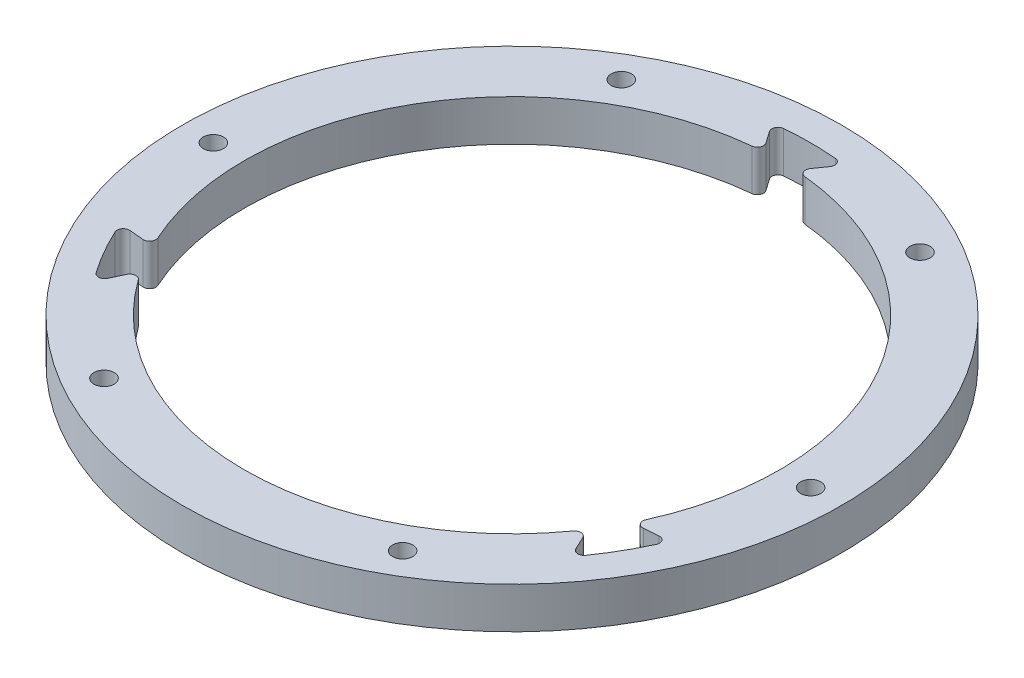
ISO-10303-21;
HEADER;
FILE_DESCRIPTION(('STEP AP214'),'2;1');
FILE_NAME('part.step','',(''),(''),'','','');
FILE_SCHEMA(('AUTOMOTIVE_DESIGN { 1 0 10303 214 1 1 1 1 }'));
ENDSEC;
DATA;
#1=APPLICATION_CONTEXT('core data for automotive mechanical design processes');
#2=APPLICATION_PROTOCOL_DEFINITION('international standard','automotive_design',2000,#1);
#3=PRODUCT_CONTEXT('',#1,'mechanical');
#4=PRODUCT('Part','Part','',(#3));
#5=PRODUCT_RELATED_PRODUCT_CATEGORY('part','',(#4));
#6=PRODUCT_DEFINITION_FORMATION('','',#4);
#7=PRODUCT_DEFINITION_CONTEXT('part definition',#1,'design');
#8=PRODUCT_DEFINITION('design','',#6,#7);
#9=PRODUCT_DEFINITION_SHAPE('','',#8);
#10=(LENGTH_UNIT() NAMED_UNIT(*) SI_UNIT(.MILLI.,.METRE.));
#11=(NAMED_UNIT(*) PLANE_ANGLE_UNIT() SI_UNIT($,.RADIAN.));
#12=(NAMED_UNIT(*) SI_UNIT($,.STERADIAN.) SOLID_ANGLE_UNIT());
#13=UNCERTAINTY_MEASURE_WITH_UNIT(LENGTH_MEASURE(1.E-05),#10,'distance_accuracy_value','');
#14=(GEOMETRIC_REPRESENTATION_CONTEXT(3) GLOBAL_UNCERTAINTY_ASSIGNED_CONTEXT((#13)) GLOBAL_UNIT_ASSIGNED_CONTEXT((#10,
#11,#12)) REPRESENTATION_CONTEXT('',''));
#15=CARTESIAN_POINT('',(0.,0.,0.));
#16=DIRECTION('',(0.,0.,1.));
#17=DIRECTION('',(1.,0.,0.));
#18=AXIS2_PLACEMENT_3D('',#15,#16,#17);
#19=CARTESIAN_POINT('',(0.,10.,80.));
#20=DIRECTION('',(0.,-1.,0.));
#21=DIRECTION('',(0.,0.,-1.));
#22=AXIS2_PLACEMENT_3D('',#19,#20,#21);
#23=PLANE('',#22);
#24=CARTESIAN_POINT('',(-36.2500000000001,10.,-62.7868417743718));
#25=DIRECTION('',(0.,1.,0.));
#26=DIRECTION('',(0.,0.,1.));
#27=AXIS2_PLACEMENT_3D('',#24,#25,#26);
#28=CIRCLE('',#27,2.45744999999999);
#29=CARTESIAN_POINT('',(-36.2500000000001,10.,-60.3293917743718));
#30=VERTEX_POINT('',#29);
#31=EDGE_CURVE('E770',#30,#30,#28,.T.);
#32=ORIENTED_EDGE('',*,*,#31,.F.);
#33=EDGE_LOOP('',(#32));
#34=FACE_BOUND('',#33,.T.);
#35=CARTESIAN_POINT('',(0.,10.,0.));
#36=DIRECTION('',(0.,-1.,0.));
#37=DIRECTION('',(0.,0.,-1.));
#38=AXIS2_PLACEMENT_3D('',#35,#36,#37);
#39=CIRCLE('',#38,80.);
#40=CARTESIAN_POINT('',(0.,10.,-80.));
#41=VERTEX_POINT('',#40);
#42=EDGE_CURVE('E242',#41,#41,#39,.T.);
#43=ORIENTED_EDGE('',*,*,#42,.F.);
#44=EDGE_LOOP('',(#43));
#45=FACE_BOUND('',#44,.T.);
#46=DIRECTION('',(0.422618261740713,0.,0.906307787036644));
#47=VECTOR('',#46,1.);
#48=CARTESIAN_POINT('',(57.9010744784291,10.,43.631589178523));
#49=LINE('',#48,#47);
#50=CARTESIAN_POINT('',(55.3581681828402,10.,38.1783090294255));
#51=VERTEX_POINT('',#50);
#52=CARTESIAN_POINT('',(56.8246262874602,10.,41.3231385834203));
#53=VERTEX_POINT('',#52);
#54=EDGE_CURVE('E360',#51,#53,#49,.T.);
#55=ORIENTED_EDGE('',*,*,#54,.F.);
#56=CARTESIAN_POINT('',(53.9987065022852,10.,38.8122364220365));
#57=DIRECTION('',(0.,-1.,0.));
#58=DIRECTION('',(0.,0.,-1.));
#59=AXIS2_PLACEMENT_3D('',#56,#57,#58);
#60=CIRCLE('',#59,1.5);
#61=CARTESIAN_POINT('',(52.7806905661435,10.,37.9367724425921));
#62=VERTEX_POINT('',#61);
#63=EDGE_CURVE('E325',#51,#62,#60,.F.);
#64=ORIENTED_EDGE('',*,*,#63,.T.);
#65=CARTESIAN_POINT('',(0.,10.,0.));
#66=DIRECTION('',(0.,-1.,0.));
#67=DIRECTION('',(0.,0.,-1.));
#68=AXIS2_PLACEMENT_3D('',#65,#66,#67);
#69=CIRCLE('',#68,65.);
#70=CARTESIAN_POINT('',(-52.7806905661429,10.,37.9367724425928));
#71=VERTEX_POINT('',#70);
#72=EDGE_CURVE('E243',#62,#71,#69,.T.);
#73=ORIENTED_EDGE('',*,*,#72,.T.);
#74=CARTESIAN_POINT('',(-53.9987065022847,10.,38.8122364220373));
#75=DIRECTION('',(0.,-1.,0.));
#76=DIRECTION('',(0.,0.,-1.));
#77=AXIS2_PLACEMENT_3D('',#74,#75,#76);
#78=CIRCLE('',#77,1.5);
#79=CARTESIAN_POINT('',(-55.3581681828397,10.,38.1783090294262));
#80=VERTEX_POINT('',#79);
#81=EDGE_CURVE('E286',#71,#80,#78,.F.);
#82=ORIENTED_EDGE('',*,*,#81,.T.);
#83=DIRECTION('',(0.4226182617407,0.,-0.90630778703665));
#84=VECTOR('',#83,1.);
#85=CARTESIAN_POINT('',(-54.2506339535424,10.,35.8031942099969));
#86=LINE('',#85,#84);
#87=CARTESIAN_POINT('',(-56.8246262874596,10.,41.3231385834211));
#88=VERTEX_POINT('',#87);
#89=EDGE_CURVE('E385',#88,#80,#86,.T.);
#90=ORIENTED_EDGE('',*,*,#89,.F.);
#91=CARTESIAN_POINT('',(-58.1840879680146,10.,40.68921119081));
#92=DIRECTION('',(0.,-1.,0.));
#93=DIRECTION('',(0.,0.,-1.));
#94=AXIS2_PLACEMENT_3D('',#91,#92,#93);
#95=CIRCLE('',#94,1.5);
#96=CARTESIAN_POINT('',(-59.4133292631135,10.,41.5488424131511));
#97=VERTEX_POINT('',#96);
#98=EDGE_CURVE('E314',#88,#97,#95,.T.);
#99=ORIENTED_EDGE('',*,*,#98,.T.);
#100=CARTESIAN_POINT('',(0.,10.,0.));
#101=DIRECTION('',(0.,1.,0.));
#102=DIRECTION('',(-0.866025403784436,0.,0.500000000000004));
#103=AXIS2_PLACEMENT_3D('',#100,#101,#102);
#104=CIRCLE('',#103,72.5);
#105=CARTESIAN_POINT('',(-65.6890176591816,10.,30.6790312586908));
#106=VERTEX_POINT('',#105);
#107=EDGE_CURVE('E372',#106,#97,#104,.T.);
#108=ORIENTED_EDGE('',*,*,#107,.F.);
#109=CARTESIAN_POINT('',(-64.3299345351986,10.,30.0442926809248));
#110=DIRECTION('',(0.,-1.,0.));
#111=DIRECTION('',(0.,0.,-1.));
#112=AXIS2_PLACEMENT_3D('',#109,#110,#111);
#113=CIRCLE('',#112,1.5);
#114=CARTESIAN_POINT('',(-64.1992009210771,10.,28.5500006337871));
#115=VERTEX_POINT('',#114);
#116=EDGE_CURVE('E310',#106,#115,#113,.T.);
#117=ORIENTED_EDGE('',*,*,#116,.T.);
#118=DIRECTION('',(-0.996194698091747,0.,-0.0871557427476483));
#119=VECTOR('',#118,1.);
#120=CARTESIAN_POINT('',(-66.7366018753018,10.,28.3280068154726));
#121=LINE('',#120,#119);
#122=CARTESIAN_POINT('',(-60.7424695844355,10.,28.8524254385981));
#123=VERTEX_POINT('',#122);
#124=EDGE_CURVE('E369',#123,#115,#121,.T.);
#125=ORIENTED_EDGE('',*,*,#124,.F.);
#126=CARTESIAN_POINT('',(-60.611735970314,10.,27.3581333914604));
#127=DIRECTION('',(0.,-1.,0.));
#128=DIRECTION('',(0.,0.,-1.));
#129=AXIS2_PLACEMENT_3D('',#126,#127,#128);
#130=CIRCLE('',#129,1.5);
#131=CARTESIAN_POINT('',(-59.244553955946,10.,26.7410326382696));
#132=VERTEX_POINT('',#131);
#133=EDGE_CURVE('E288',#123,#132,#130,.F.);
#134=ORIENTED_EDGE('',*,*,#133,.T.);
#135=CARTESIAN_POINT('',(-6.46386338980305,10.,-64.6778050808619));
#136=VERTEX_POINT('',#135);
#137=EDGE_CURVE('E244',#132,#136,#69,.T.);
#138=ORIENTED_EDGE('',*,*,#137,.T.);
#139=CARTESIAN_POINT('',(-6.61302946802927,10.,-66.1703698134972));
#140=DIRECTION('',(0.,-1.,0.));
#141=DIRECTION('',(0.,0.,-1.));
#142=AXIS2_PLACEMENT_3D('',#139,#140,#141);
#143=CIRCLE('',#142,1.5);
#144=CARTESIAN_POINT('',(-5.38430140159578,10.,-67.0307344680237));
#145=VERTEX_POINT('',#144);
#146=EDGE_CURVE('E209',#136,#145,#143,.F.);
#147=ORIENTED_EDGE('',*,*,#146,.T.);
#148=DIRECTION('',(0.573576436351042,0.,0.819152044288995));
#149=VECTOR('',#148,1.);
#150=CARTESIAN_POINT('',(-3.88115874571378,10.,-64.8840242801768));
#151=LINE('',#150,#149);
#152=CARTESIAN_POINT('',(-7.37457463361741,10.,-69.8731392172076));
#153=VERTEX_POINT('',#152);
#154=EDGE_CURVE('E229',#153,#145,#151,.T.);
#155=ORIENTED_EDGE('',*,*,#154,.F.);
#156=CARTESIAN_POINT('',(-6.14584656718391,10.,-70.7335038717342));
#157=DIRECTION('',(0.,-1.,0.));
#158=DIRECTION('',(0.,0.,-1.));
#159=AXIS2_PLACEMENT_3D('',#156,#157,#158);
#160=CIRCLE('',#159,1.5);
#161=CARTESIAN_POINT('',(-6.27568839606808,10.,-72.2278736718413));
#162=VERTEX_POINT('',#161);
#163=EDGE_CURVE('E277',#153,#162,#160,.T.);
#164=ORIENTED_EDGE('',*,*,#163,.T.);
#165=CARTESIAN_POINT('',(0.,10.,0.));
#166=DIRECTION('',(0.,1.,0.));
#167=DIRECTION('',(0.,0.,-1.));
#168=AXIS2_PLACEMENT_3D('',#165,#166,#167);
#169=CIRCLE('',#168,72.5);
#170=CARTESIAN_POINT('',(6.27568839606808,10.,-72.2278736718413));
#171=VERTEX_POINT('',#170);
#172=EDGE_CURVE('E225',#171,#162,#169,.T.);
#173=ORIENTED_EDGE('',*,*,#172,.F.);
#174=CARTESIAN_POINT('',(6.14584656718391,10.,-70.7335038717342));
#175=DIRECTION('',(0.,-1.,0.));
#176=DIRECTION('',(0.,0.,-1.));
#177=AXIS2_PLACEMENT_3D('',#174,#175,#176);
#178=CIRCLE('',#177,1.5);
#179=CARTESIAN_POINT('',(7.37457463361741,10.,-69.8731392172076));
#180=VERTEX_POINT('',#179);
#181=EDGE_CURVE('E224',#171,#180,#178,.T.);
#182=ORIENTED_EDGE('',*,*,#181,.T.);
#183=DIRECTION('',(0.573576436351042,0.,-0.819152044288995));
#184=VECTOR('',#183,1.);
#185=CARTESIAN_POINT('',(8.83552739687324,10.,-71.9595959939959));
#186=LINE('',#185,#184);
#187=CARTESIAN_POINT('',(5.38430140159578,10.,-67.0307344680237));
#188=VERTEX_POINT('',#187);
#189=EDGE_CURVE('E215',#188,#180,#186,.T.);
#190=ORIENTED_EDGE('',*,*,#189,.F.);
#191=CARTESIAN_POINT('',(6.61302946802927,10.,-66.1703698134972));
#192=DIRECTION('',(0.,-1.,0.));
#193=DIRECTION('',(0.,0.,-1.));
#194=AXIS2_PLACEMENT_3D('',#191,#192,#193);
#195=CIRCLE('',#194,1.5);
#196=CARTESIAN_POINT('',(6.46386338980305,10.,-64.6778050808619));
#197=VERTEX_POINT('',#196);
#198=EDGE_CURVE('E198',#188,#197,#195,.F.);
#199=ORIENTED_EDGE('',*,*,#198,.T.);
#200=CARTESIAN_POINT('',(59.2445539559464,10.,26.7410326382688));
#201=VERTEX_POINT('',#200);
#202=EDGE_CURVE('E240',#197,#201,#69,.T.);
#203=ORIENTED_EDGE('',*,*,#202,.T.);
#204=CARTESIAN_POINT('',(60.6117359703144,10.,27.3581333914596));
#205=DIRECTION('',(0.,-1.,0.));
#206=DIRECTION('',(0.,0.,-1.));
#207=AXIS2_PLACEMENT_3D('',#204,#205,#206);
#208=CIRCLE('',#207,1.5);
#209=CARTESIAN_POINT('',(60.7424695844359,10.,28.8524254385972));
#210=VERTEX_POINT('',#209);
#211=EDGE_CURVE('E323',#201,#210,#208,.F.);
#212=ORIENTED_EDGE('',*,*,#211,.T.);
#213=DIRECTION('',(-0.996194698091745,0.,0.0871557427476622));
#214=VECTOR('',#213,1.);
#215=CARTESIAN_POINT('',(58.1317926992566,10.,29.0808300701796));
#216=LINE('',#215,#214);
#217=CARTESIAN_POINT('',(64.1992009210775,10.,28.5500006337862));
#218=VERTEX_POINT('',#217);
#219=EDGE_CURVE('E351',#218,#210,#216,.T.);
#220=ORIENTED_EDGE('',*,*,#219,.F.);
#221=CARTESIAN_POINT('',(64.329934535199,10.,30.0442926809239));
#222=DIRECTION('',(0.,-1.,0.));
#223=DIRECTION('',(0.,0.,-1.));
#224=AXIS2_PLACEMENT_3D('',#221,#222,#223);
#225=CIRCLE('',#224,1.5);
#226=CARTESIAN_POINT('',(65.6890176591821,10.,30.6790312586899));
#227=VERTEX_POINT('',#226);
#228=EDGE_CURVE('E43',#218,#227,#225,.T.);
#229=ORIENTED_EDGE('',*,*,#228,.T.);
#230=CARTESIAN_POINT('',(0.,10.,0.));
#231=DIRECTION('',(0.,1.,0.));
#232=DIRECTION('',(0.866025403784443,0.,0.499999999999992));
#233=AXIS2_PLACEMENT_3D('',#230,#231,#232);
#234=CIRCLE('',#233,72.5);
#235=CARTESIAN_POINT('',(59.4133292631141,10.,41.5488424131503));
#236=VERTEX_POINT('',#235);
#237=EDGE_CURVE('E350',#236,#227,#234,.T.);
#238=ORIENTED_EDGE('',*,*,#237,.F.);
#239=CARTESIAN_POINT('',(58.1840879680152,10.,40.6892111908092));
#240=DIRECTION('',(0.,-1.,0.));
#241=DIRECTION('',(0.,0.,-1.));
#242=AXIS2_PLACEMENT_3D('',#239,#240,#241);
#243=CIRCLE('',#242,1.5);
#244=EDGE_CURVE('E344',#236,#53,#243,.T.);
#245=ORIENTED_EDGE('',*,*,#244,.T.);
#246=EDGE_LOOP('',(#55,#64,#73,#82,#90,#99,#108,#117,#125,#134,#138,#147,#155,#164,#173,#182,
#190,#199,#203,#212,#220,#229,#238,#245));
#247=FACE_BOUND('',#246,.T.);
#248=CARTESIAN_POINT('',(-72.5,10.,2.63677968348475E-13));
#249=DIRECTION('',(0.,1.,0.));
#250=DIRECTION('',(0.,0.,1.));
#251=AXIS2_PLACEMENT_3D('',#248,#249,#250);
#252=CIRCLE('',#251,2.45744999999999);
#253=CARTESIAN_POINT('',(-72.5,10.,2.45745000000025));
#254=VERTEX_POINT('',#253);
#255=EDGE_CURVE('E776',#254,#254,#252,.T.);
#256=ORIENTED_EDGE('',*,*,#255,.F.);
#257=EDGE_LOOP('',(#256));
#258=FACE_BOUND('',#257,.T.);
#259=CARTESIAN_POINT('',(-36.2499999999996,10.,62.786841774372));
#260=DIRECTION('',(0.,1.,0.));
#261=DIRECTION('',(0.,0.,1.));
#262=AXIS2_PLACEMENT_3D('',#259,#260,#261);
#263=CIRCLE('',#262,2.45744999999999);
#264=CARTESIAN_POINT('',(-36.2499999999996,10.,65.244291774372));
#265=VERTEX_POINT('',#264);
#266=EDGE_CURVE('E782',#265,#265,#263,.T.);
#267=ORIENTED_EDGE('',*,*,#266,.F.);
#268=EDGE_LOOP('',(#267));
#269=FACE_BOUND('',#268,.T.);
#270=CARTESIAN_POINT('',(36.2500000000001,10.,62.7868417743718));
#271=DIRECTION('',(0.,1.,0.));
#272=DIRECTION('',(0.,0.,1.));
#273=AXIS2_PLACEMENT_3D('',#270,#271,#272);
#274=CIRCLE('',#273,2.45744999999999);
#275=CARTESIAN_POINT('',(36.2500000000001,10.,65.2442917743717));
#276=VERTEX_POINT('',#275);
#277=EDGE_CURVE('E788',#276,#276,#274,.T.);
#278=ORIENTED_EDGE('',*,*,#277,.F.);
#279=EDGE_LOOP('',(#278));
#280=FACE_BOUND('',#279,.T.);
#281=CARTESIAN_POINT('',(72.5,10.,-7.70217223333702E-13));
#282=DIRECTION('',(0.,1.,0.));
#283=DIRECTION('',(0.,0.,1.));
#284=AXIS2_PLACEMENT_3D('',#281,#282,#283);
#285=CIRCLE('',#284,2.45744999999999);
#286=CARTESIAN_POINT('',(72.5,10.,2.45744999999922));
#287=VERTEX_POINT('',#286);
#288=EDGE_CURVE('E794',#287,#287,#285,.T.);
#289=ORIENTED_EDGE('',*,*,#288,.F.);
#290=EDGE_LOOP('',(#289));
#291=FACE_BOUND('',#290,.T.);
#292=CARTESIAN_POINT('',(36.2499999999992,10.,-62.7868417743723));
#293=DIRECTION('',(0.,1.,0.));
#294=DIRECTION('',(0.,0.,1.));
#295=AXIS2_PLACEMENT_3D('',#292,#293,#294);
#296=CIRCLE('',#295,2.45744999999999);
#297=CARTESIAN_POINT('',(36.2499999999992,10.,-60.3293917743723));
#298=VERTEX_POINT('',#297);
#299=EDGE_CURVE('E800',#298,#298,#296,.T.);
#300=ORIENTED_EDGE('',*,*,#299,.F.);
#301=EDGE_LOOP('',(#300));
#302=FACE_BOUND('',#301,.T.);
#303=ADVANCED_FACE('F35',(#34,#45,#247,#258,#269,#280,#291,#302),#23,.F.);
#304=CARTESIAN_POINT('',(0.,-0.750000000000001,0.));
#305=DIRECTION('',(0.,-1.,0.));
#306=DIRECTION('',(0.,0.,-1.));
#307=AXIS2_PLACEMENT_3D('',#304,#305,#306);
#308=CYLINDRICAL_SURFACE('',#307,65.);
#309=CARTESIAN_POINT('',(0.,0.,0.));
#310=DIRECTION('',(0.,-1.,0.));
#311=DIRECTION('',(0.,0.,-1.));
#312=AXIS2_PLACEMENT_3D('',#309,#310,#311);
#313=CIRCLE('',#312,65.);
#314=CARTESIAN_POINT('',(6.46386338980305,0.,-64.6778050808619));
#315=VERTEX_POINT('',#314);
#316=CARTESIAN_POINT('',(59.2445539559464,0.,26.7410326382688));
#317=VERTEX_POINT('',#316);
#318=EDGE_CURVE('E251',#315,#317,#313,.T.);
#319=ORIENTED_EDGE('',*,*,#318,.T.);
#320=DIRECTION('',(0.,-1.,0.));
#321=VECTOR('',#320,1.);
#322=CARTESIAN_POINT('',(59.2445539559464,-0.750000000000001,26.7410326382688));
#323=LINE('',#322,#321);
#324=EDGE_CURVE('E332',#317,#201,#323,.F.);
#325=ORIENTED_EDGE('',*,*,#324,.T.);
#326=ORIENTED_EDGE('',*,*,#202,.F.);
#327=DIRECTION('',(0.,-1.,0.));
#328=VECTOR('',#327,1.);
#329=CARTESIAN_POINT('',(6.46386338980305,-0.750000000000001,-64.6778050808619));
#330=LINE('',#329,#328);
#331=EDGE_CURVE('E203',#197,#315,#330,.T.);
#332=ORIENTED_EDGE('',*,*,#331,.T.);
#333=EDGE_LOOP('',(#319,#325,#326,#332));
#334=FACE_BOUND('',#333,.T.);
#335=ADVANCED_FACE('F461',(#334),#308,.F.);
#336=ORIENTED_EDGE('',*,*,#72,.F.);
#337=DIRECTION('',(0.,-1.,0.));
#338=VECTOR('',#337,1.);
#339=CARTESIAN_POINT('',(52.7806905661435,-0.750000000000001,37.9367724425921));
#340=LINE('',#339,#338);
#341=CARTESIAN_POINT('',(52.7806905661435,0.,37.9367724425921));
#342=VERTEX_POINT('',#341);
#343=EDGE_CURVE('E327',#62,#342,#340,.T.);
#344=ORIENTED_EDGE('',*,*,#343,.T.);
#345=CARTESIAN_POINT('',(-52.7806905661429,0.,37.9367724425928));
#346=VERTEX_POINT('',#345);
#347=EDGE_CURVE('E253',#342,#346,#313,.T.);
#348=ORIENTED_EDGE('',*,*,#347,.T.);
#349=DIRECTION('',(0.,-1.,0.));
#350=VECTOR('',#349,1.);
#351=CARTESIAN_POINT('',(-52.7806905661429,-0.750000000000001,37.9367724425928));
#352=LINE('',#351,#350);
#353=EDGE_CURVE('E297',#346,#71,#352,.F.);
#354=ORIENTED_EDGE('',*,*,#353,.T.);
#355=EDGE_LOOP('',(#336,#344,#348,#354));
#356=FACE_BOUND('',#355,.T.);
#357=ADVANCED_FACE('F411',(#356),#308,.F.);
#358=ORIENTED_EDGE('',*,*,#137,.F.);
#359=DIRECTION('',(0.,-1.,0.));
#360=VECTOR('',#359,1.);
#361=CARTESIAN_POINT('',(-59.244553955946,-0.750000000000001,26.7410326382696));
#362=LINE('',#361,#360);
#363=CARTESIAN_POINT('',(-59.244553955946,0.,26.7410326382696));
#364=VERTEX_POINT('',#363);
#365=EDGE_CURVE('E290',#132,#364,#362,.T.);
#366=ORIENTED_EDGE('',*,*,#365,.T.);
#367=CARTESIAN_POINT('',(-6.46386338980305,0.,-64.6778050808619));
#368=VERTEX_POINT('',#367);
#369=EDGE_CURVE('E250',#364,#368,#313,.T.);
#370=ORIENTED_EDGE('',*,*,#369,.T.);
#371=DIRECTION('',(0.,-1.,0.));
#372=VECTOR('',#371,1.);
#373=CARTESIAN_POINT('',(-6.46386338980305,-0.750000000000001,-64.6778050808619));
#374=LINE('',#373,#372);
#375=EDGE_CURVE('E208',#368,#136,#374,.F.);
#376=ORIENTED_EDGE('',*,*,#375,.T.);
#377=EDGE_LOOP('',(#358,#366,#370,#376));
#378=FACE_BOUND('',#377,.T.);
#379=ADVANCED_FACE('F440',(#378),#308,.F.);
#380=CARTESIAN_POINT('',(0.,0.,65.));
#381=DIRECTION('',(0.,1.,0.));
#382=DIRECTION('',(0.,0.,1.));
#383=AXIS2_PLACEMENT_3D('',#380,#381,#382);
#384=PLANE('',#383);
#385=CARTESIAN_POINT('',(36.2499999999992,0.,-62.7868417743723));
#386=DIRECTION('',(0.,1.,0.));
#387=DIRECTION('',(0.,0.,1.));
#388=AXIS2_PLACEMENT_3D('',#385,#386,#387);
#389=CIRCLE('',#388,2.45745);
#390=CARTESIAN_POINT('',(36.2499999999992,0.,-60.3293917743723));
#391=VERTEX_POINT('',#390);
#392=EDGE_CURVE('E797',#391,#391,#389,.T.);
#393=ORIENTED_EDGE('',*,*,#392,.T.);
#394=EDGE_LOOP('',(#393));
#395=FACE_BOUND('',#394,.T.);
#396=CARTESIAN_POINT('',(72.5,0.,-7.70217223333702E-13));
#397=DIRECTION('',(0.,1.,0.));
#398=DIRECTION('',(0.,0.,1.));
#399=AXIS2_PLACEMENT_3D('',#396,#397,#398);
#400=CIRCLE('',#399,2.45745);
#401=CARTESIAN_POINT('',(72.5,0.,2.45744999999923));
#402=VERTEX_POINT('',#401);
#403=EDGE_CURVE('E791',#402,#402,#400,.T.);
#404=ORIENTED_EDGE('',*,*,#403,.T.);
#405=EDGE_LOOP('',(#404));
#406=FACE_BOUND('',#405,.T.);
#407=CARTESIAN_POINT('',(36.2500000000001,0.,62.7868417743718));
#408=DIRECTION('',(0.,1.,0.));
#409=DIRECTION('',(0.,0.,1.));
#410=AXIS2_PLACEMENT_3D('',#407,#408,#409);
#411=CIRCLE('',#410,2.45745);
#412=CARTESIAN_POINT('',(36.2500000000001,0.,65.2442917743718));
#413=VERTEX_POINT('',#412);
#414=EDGE_CURVE('E785',#413,#413,#411,.T.);
#415=ORIENTED_EDGE('',*,*,#414,.T.);
#416=EDGE_LOOP('',(#415));
#417=FACE_BOUND('',#416,.T.);
#418=CARTESIAN_POINT('',(-36.2499999999996,0.,62.786841774372));
#419=DIRECTION('',(0.,1.,0.));
#420=DIRECTION('',(0.,0.,1.));
#421=AXIS2_PLACEMENT_3D('',#418,#419,#420);
#422=CIRCLE('',#421,2.45745);
#423=CARTESIAN_POINT('',(-36.2499999999996,0.,65.244291774372));
#424=VERTEX_POINT('',#423);
#425=EDGE_CURVE('E779',#424,#424,#422,.T.);
#426=ORIENTED_EDGE('',*,*,#425,.T.);
#427=EDGE_LOOP('',(#426));
#428=FACE_BOUND('',#427,.T.);
#429=CARTESIAN_POINT('',(-72.5,0.,2.63677968348475E-13));
#430=DIRECTION('',(0.,1.,0.));
#431=DIRECTION('',(0.,0.,1.));
#432=AXIS2_PLACEMENT_3D('',#429,#430,#431);
#433=CIRCLE('',#432,2.45745);
#434=CARTESIAN_POINT('',(-72.5,0.,2.45745000000026));
#435=VERTEX_POINT('',#434);
#436=EDGE_CURVE('E773',#435,#435,#433,.T.);
#437=ORIENTED_EDGE('',*,*,#436,.T.);
#438=EDGE_LOOP('',(#437));
#439=FACE_BOUND('',#438,.T.);
#440=CARTESIAN_POINT('',(-36.2500000000001,0.,-62.7868417743718));
#441=DIRECTION('',(0.,1.,0.));
#442=DIRECTION('',(0.,0.,1.));
#443=AXIS2_PLACEMENT_3D('',#440,#441,#442);
#444=CIRCLE('',#443,2.45745);
#445=CARTESIAN_POINT('',(-36.2500000000001,0.,-60.3293917743718));
#446=VERTEX_POINT('',#445);
#447=EDGE_CURVE('E379',#446,#446,#444,.T.);
#448=ORIENTED_EDGE('',*,*,#447,.T.);
#449=EDGE_LOOP('',(#448));
#450=FACE_BOUND('',#449,.T.);
#451=ORIENTED_EDGE('',*,*,#347,.F.);
#452=CARTESIAN_POINT('',(53.9987065022852,0.,38.8122364220365));
#453=DIRECTION('',(0.,1.,0.));
#454=DIRECTION('',(0.,0.,1.));
#455=AXIS2_PLACEMENT_3D('',#452,#453,#454);
#456=CIRCLE('',#455,1.5);
#457=CARTESIAN_POINT('',(55.3581681828402,0.,38.1783090294255));
#458=VERTEX_POINT('',#457);
#459=EDGE_CURVE('E330',#342,#458,#456,.F.);
#460=ORIENTED_EDGE('',*,*,#459,.T.);
#461=DIRECTION('',(0.422618261740713,0.,0.906307787036644));
#462=VECTOR('',#461,1.);
#463=CARTESIAN_POINT('',(57.9010744784291,0.,43.631589178523));
#464=LINE('',#463,#462);
#465=CARTESIAN_POINT('',(56.8246262874602,0.,41.3231385834203));
#466=VERTEX_POINT('',#465);
#467=EDGE_CURVE('E374',#458,#466,#464,.T.);
#468=ORIENTED_EDGE('',*,*,#467,.T.);
#469=CARTESIAN_POINT('',(58.1840879680152,0.,40.6892111908092));
#470=DIRECTION('',(0.,1.,0.));
#471=DIRECTION('',(0.,0.,1.));
#472=AXIS2_PLACEMENT_3D('',#469,#470,#471);
#473=CIRCLE('',#472,1.5);
#474=CARTESIAN_POINT('',(59.4133292631141,0.,41.5488424131503));
#475=VERTEX_POINT('',#474);
#476=EDGE_CURVE('E346',#466,#475,#473,.T.);
#477=ORIENTED_EDGE('',*,*,#476,.T.);
#478=CARTESIAN_POINT('',(0.,0.,0.));
#479=DIRECTION('',(0.,1.,0.));
#480=DIRECTION('',(0.866025403784443,0.,0.499999999999992));
#481=AXIS2_PLACEMENT_3D('',#478,#479,#480);
#482=CIRCLE('',#481,72.5);
#483=CARTESIAN_POINT('',(65.6890176591821,0.,30.6790312586899));
#484=VERTEX_POINT('',#483);
#485=EDGE_CURVE('E367',#475,#484,#482,.T.);
#486=ORIENTED_EDGE('',*,*,#485,.T.);
#487=CARTESIAN_POINT('',(64.329934535199,0.,30.0442926809239));
#488=DIRECTION('',(0.,1.,0.));
#489=DIRECTION('',(0.,0.,1.));
#490=AXIS2_PLACEMENT_3D('',#487,#488,#489);
#491=CIRCLE('',#490,1.5);
#492=CARTESIAN_POINT('',(64.1992009210775,0.,28.5500006337862));
#493=VERTEX_POINT('',#492);
#494=EDGE_CURVE('E11',#484,#493,#491,.T.);
#495=ORIENTED_EDGE('',*,*,#494,.T.);
#496=DIRECTION('',(-0.996194698091745,0.,0.0871557427476622));
#497=VECTOR('',#496,1.);
#498=CARTESIAN_POINT('',(58.1317926992566,0.,29.0808300701796));
#499=LINE('',#498,#497);
#500=CARTESIAN_POINT('',(60.7424695844359,0.,28.8524254385972));
#501=VERTEX_POINT('',#500);
#502=EDGE_CURVE('E366',#493,#501,#499,.T.);
#503=ORIENTED_EDGE('',*,*,#502,.T.);
#504=CARTESIAN_POINT('',(60.6117359703144,0.,27.3581333914596));
#505=DIRECTION('',(0.,1.,0.));
#506=DIRECTION('',(0.,0.,1.));
#507=AXIS2_PLACEMENT_3D('',#504,#505,#506);
#508=CIRCLE('',#507,1.5);
#509=EDGE_CURVE('E50',#501,#317,#508,.F.);
#510=ORIENTED_EDGE('',*,*,#509,.T.);
#511=ORIENTED_EDGE('',*,*,#318,.F.);
#512=CARTESIAN_POINT('',(6.61302946802927,0.,-66.1703698134972));
#513=DIRECTION('',(0.,1.,0.));
#514=DIRECTION('',(0.,0.,1.));
#515=AXIS2_PLACEMENT_3D('',#512,#513,#514);
#516=CIRCLE('',#515,1.5);
#517=CARTESIAN_POINT('',(5.38430140159578,0.,-67.0307344680237));
#518=VERTEX_POINT('',#517);
#519=EDGE_CURVE('E262',#315,#518,#516,.F.);
#520=ORIENTED_EDGE('',*,*,#519,.T.);
#521=DIRECTION('',(0.573576436351042,0.,-0.819152044288995));
#522=VECTOR('',#521,1.);
#523=CARTESIAN_POINT('',(8.83552739687324,0.,-71.9595959939959));
#524=LINE('',#523,#522);
#525=CARTESIAN_POINT('',(7.37457463361741,0.,-69.8731392172076));
#526=VERTEX_POINT('',#525);
#527=EDGE_CURVE('E218',#518,#526,#524,.T.);
#528=ORIENTED_EDGE('',*,*,#527,.T.);
#529=CARTESIAN_POINT('',(6.14584656718391,0.,-70.7335038717342));
#530=DIRECTION('',(0.,1.,0.));
#531=DIRECTION('',(0.,0.,1.));
#532=AXIS2_PLACEMENT_3D('',#529,#530,#531);
#533=CIRCLE('',#532,1.5);
#534=CARTESIAN_POINT('',(6.27568839606808,0.,-72.2278736718413));
#535=VERTEX_POINT('',#534);
#536=EDGE_CURVE('E275',#526,#535,#533,.T.);
#537=ORIENTED_EDGE('',*,*,#536,.T.);
#538=CARTESIAN_POINT('',(0.,0.,0.));
#539=DIRECTION('',(0.,1.,0.));
#540=DIRECTION('',(0.,0.,-1.));
#541=AXIS2_PLACEMENT_3D('',#538,#539,#540);
#542=CIRCLE('',#541,72.5);
#543=CARTESIAN_POINT('',(-6.27568839606808,0.,-72.2278736718413));
#544=VERTEX_POINT('',#543);
#545=EDGE_CURVE('E392',#535,#544,#542,.T.);
#546=ORIENTED_EDGE('',*,*,#545,.T.);
#547=CARTESIAN_POINT('',(-6.14584656718391,0.,-70.7335038717342));
#548=DIRECTION('',(0.,1.,0.));
#549=DIRECTION('',(0.,0.,1.));
#550=AXIS2_PLACEMENT_3D('',#547,#548,#549);
#551=CIRCLE('',#550,1.5);
#552=CARTESIAN_POINT('',(-7.37457463361741,0.,-69.8731392172076));
#553=VERTEX_POINT('',#552);
#554=EDGE_CURVE('E279',#544,#553,#551,.T.);
#555=ORIENTED_EDGE('',*,*,#554,.T.);
#556=DIRECTION('',(0.573576436351042,0.,0.819152044288995));
#557=VECTOR('',#556,1.);
#558=CARTESIAN_POINT('',(-3.88115874571378,0.,-64.8840242801768));
#559=LINE('',#558,#557);
#560=CARTESIAN_POINT('',(-5.38430140159578,0.,-67.0307344680237));
#561=VERTEX_POINT('',#560);
#562=EDGE_CURVE('E235',#553,#561,#559,.T.);
#563=ORIENTED_EDGE('',*,*,#562,.T.);
#564=CARTESIAN_POINT('',(-6.61302946802927,0.,-66.1703698134972));
#565=DIRECTION('',(0.,1.,0.));
#566=DIRECTION('',(0.,0.,1.));
#567=AXIS2_PLACEMENT_3D('',#564,#565,#566);
#568=CIRCLE('',#567,1.5);
#569=EDGE_CURVE('E259',#561,#368,#568,.F.);
#570=ORIENTED_EDGE('',*,*,#569,.T.);
#571=ORIENTED_EDGE('',*,*,#369,.F.);
#572=CARTESIAN_POINT('',(-60.611735970314,0.,27.3581333914604));
#573=DIRECTION('',(0.,1.,0.));
#574=DIRECTION('',(0.,0.,1.));
#575=AXIS2_PLACEMENT_3D('',#572,#573,#574);
#576=CIRCLE('',#575,1.5);
#577=CARTESIAN_POINT('',(-60.7424695844355,0.,28.8524254385981));
#578=VERTEX_POINT('',#577);
#579=EDGE_CURVE('E295',#364,#578,#576,.F.);
#580=ORIENTED_EDGE('',*,*,#579,.T.);
#581=DIRECTION('',(-0.996194698091747,0.,-0.0871557427476483));
#582=VECTOR('',#581,1.);
#583=CARTESIAN_POINT('',(-66.7366018753018,0.,28.3280068154726));
#584=LINE('',#583,#582);
#585=CARTESIAN_POINT('',(-64.1992009210771,0.,28.5500006337871));
#586=VERTEX_POINT('',#585);
#587=EDGE_CURVE('E382',#578,#586,#584,.T.);
#588=ORIENTED_EDGE('',*,*,#587,.T.);
#589=CARTESIAN_POINT('',(-64.3299345351986,0.,30.0442926809248));
#590=DIRECTION('',(0.,1.,0.));
#591=DIRECTION('',(0.,0.,1.));
#592=AXIS2_PLACEMENT_3D('',#589,#590,#591);
#593=CIRCLE('',#592,1.5);
#594=CARTESIAN_POINT('',(-65.6890176591816,0.,30.6790312586908));
#595=VERTEX_POINT('',#594);
#596=EDGE_CURVE('E312',#586,#595,#593,.T.);
#597=ORIENTED_EDGE('',*,*,#596,.T.);
#598=CARTESIAN_POINT('',(0.,0.,0.));
#599=DIRECTION('',(0.,1.,0.));
#600=DIRECTION('',(-0.866025403784436,0.,0.500000000000004));
#601=AXIS2_PLACEMENT_3D('',#598,#599,#600);
#602=CIRCLE('',#601,72.5);
#603=CARTESIAN_POINT('',(-59.4133292631135,0.,41.5488424131511));
#604=VERTEX_POINT('',#603);
#605=EDGE_CURVE('E232',#595,#604,#602,.T.);
#606=ORIENTED_EDGE('',*,*,#605,.T.);
#607=CARTESIAN_POINT('',(-58.1840879680146,0.,40.68921119081));
#608=DIRECTION('',(0.,1.,0.));
#609=DIRECTION('',(0.,0.,1.));
#610=AXIS2_PLACEMENT_3D('',#607,#608,#609);
#611=CIRCLE('',#610,1.5);
#612=CARTESIAN_POINT('',(-56.8246262874596,0.,41.3231385834211));
#613=VERTEX_POINT('',#612);
#614=EDGE_CURVE('E316',#604,#613,#611,.T.);
#615=ORIENTED_EDGE('',*,*,#614,.T.);
#616=DIRECTION('',(0.4226182617407,0.,-0.90630778703665));
#617=VECTOR('',#616,1.);
#618=CARTESIAN_POINT('',(-54.2506339535424,0.,35.8031942099969));
#619=LINE('',#618,#617);
#620=CARTESIAN_POINT('',(-55.3581681828397,0.,38.1783090294262));
#621=VERTEX_POINT('',#620);
#622=EDGE_CURVE('E226',#613,#621,#619,.T.);
#623=ORIENTED_EDGE('',*,*,#622,.T.);
#624=CARTESIAN_POINT('',(-53.9987065022847,0.,38.8122364220373));
#625=DIRECTION('',(0.,1.,0.));
#626=DIRECTION('',(0.,0.,1.));
#627=AXIS2_PLACEMENT_3D('',#624,#625,#626);
#628=CIRCLE('',#627,1.5);
#629=EDGE_CURVE('E292',#621,#346,#628,.F.);
#630=ORIENTED_EDGE('',*,*,#629,.T.);
#631=EDGE_LOOP('',(#451,#460,#468,#477,#486,#495,#503,#510,#511,#520,#528,#537,#546,#555,#563,
#570,#571,#580,#588,#597,#606,#615,#623,#630));
#632=FACE_BOUND('',#631,.T.);
#633=CARTESIAN_POINT('',(0.,0.,0.));
#634=DIRECTION('',(0.,-1.,0.));
#635=DIRECTION('',(0.,0.,-1.));
#636=AXIS2_PLACEMENT_3D('',#633,#634,#635);
#637=CIRCLE('',#636,80.);
#638=CARTESIAN_POINT('',(0.,0.,-80.));
#639=VERTEX_POINT('',#638);
#640=EDGE_CURVE('E247',#639,#639,#637,.T.);
#641=ORIENTED_EDGE('',*,*,#640,.T.);
#642=EDGE_LOOP('',(#641));
#643=FACE_BOUND('',#642,.T.);
#644=ADVANCED_FACE('F364',(#395,#406,#417,#428,#439,#450,#632,#643),#384,.F.);
#645=CARTESIAN_POINT('',(0.,-0.750000000000001,0.));
#646=DIRECTION('',(0.,-1.,0.));
#647=DIRECTION('',(0.,0.,-1.));
#648=AXIS2_PLACEMENT_3D('',#645,#646,#647);
#649=CYLINDRICAL_SURFACE('',#648,80.);
#650=ORIENTED_EDGE('',*,*,#640,.F.);
#651=EDGE_LOOP('',(#650));
#652=FACE_BOUND('',#651,.T.);
#653=ORIENTED_EDGE('',*,*,#42,.T.);
#654=EDGE_LOOP('',(#653));
#655=FACE_BOUND('',#654,.T.);
#656=ADVANCED_FACE('F487',(#652,#655),#649,.T.);
#657=CARTESIAN_POINT('',(-3.88115874571378,0.,-64.8840242801768));
#658=DIRECTION('',(-0.819152044288995,0.,0.573576436351042));
#659=DIRECTION('',(0.573576436351042,0.,0.819152044288995));
#660=AXIS2_PLACEMENT_3D('',#657,#658,#659);
#661=PLANE('',#660);
#662=ORIENTED_EDGE('',*,*,#154,.T.);
#663=DIRECTION('',(0.,-1.,0.));
#664=VECTOR('',#663,1.);
#665=CARTESIAN_POINT('',(-5.38430140159578,0.,-67.0307344680237));
#666=LINE('',#665,#664);
#667=EDGE_CURVE('E267',#145,#561,#666,.T.);
#668=ORIENTED_EDGE('',*,*,#667,.T.);
#669=ORIENTED_EDGE('',*,*,#562,.F.);
#670=DIRECTION('',(0.,-1.,0.));
#671=VECTOR('',#670,1.);
#672=CARTESIAN_POINT('',(-7.37457463361741,10.,-69.8731392172076));
#673=LINE('',#672,#671);
#674=EDGE_CURVE('E264',#553,#153,#673,.F.);
#675=ORIENTED_EDGE('',*,*,#674,.T.);
#676=EDGE_LOOP('',(#662,#668,#669,#675));
#677=FACE_BOUND('',#676,.T.);
#678=ADVANCED_FACE('F448',(#677),#661,.F.);
#679=CARTESIAN_POINT('',(0.,0.,0.));
#680=DIRECTION('',(0.,1.,0.));
#681=DIRECTION('',(0.,0.,1.));
#682=AXIS2_PLACEMENT_3D('',#679,#680,#681);
#683=CYLINDRICAL_SURFACE('',#682,72.5);
#684=ORIENTED_EDGE('',*,*,#545,.F.);
#685=DIRECTION('',(0.,1.,0.));
#686=VECTOR('',#685,1.);
#687=CARTESIAN_POINT('',(6.27568839606808,0.,-72.2278736718413));
#688=LINE('',#687,#686);
#689=EDGE_CURVE('E271',#535,#171,#688,.T.);
#690=ORIENTED_EDGE('',*,*,#689,.T.);
#691=ORIENTED_EDGE('',*,*,#172,.T.);
#692=DIRECTION('',(0.,1.,0.));
#693=VECTOR('',#692,1.);
#694=CARTESIAN_POINT('',(-6.27568839606808,0.,-72.2278736718413));
#695=LINE('',#694,#693);
#696=EDGE_CURVE('E269',#162,#544,#695,.F.);
#697=ORIENTED_EDGE('',*,*,#696,.T.);
#698=EDGE_LOOP('',(#684,#690,#691,#697));
#699=FACE_BOUND('',#698,.T.);
#700=ADVANCED_FACE('F454',(#699),#683,.F.);
#701=CARTESIAN_POINT('',(8.83552739687324,0.,-71.9595959939959));
#702=DIRECTION('',(0.819152044288995,0.,0.573576436351042));
#703=DIRECTION('',(0.573576436351042,0.,-0.819152044288995));
#704=AXIS2_PLACEMENT_3D('',#701,#702,#703);
#705=PLANE('',#704);
#706=ORIENTED_EDGE('',*,*,#527,.F.);
#707=DIRECTION('',(0.,-1.,0.));
#708=VECTOR('',#707,1.);
#709=CARTESIAN_POINT('',(5.38430140159578,0.,-67.0307344680237));
#710=LINE('',#709,#708);
#711=EDGE_CURVE('E202',#518,#188,#710,.F.);
#712=ORIENTED_EDGE('',*,*,#711,.T.);
#713=ORIENTED_EDGE('',*,*,#189,.T.);
#714=DIRECTION('',(0.,-1.,0.));
#715=VECTOR('',#714,1.);
#716=CARTESIAN_POINT('',(7.37457463361741,0.,-69.8731392172076));
#717=LINE('',#716,#715);
#718=EDGE_CURVE('E219',#180,#526,#717,.T.);
#719=ORIENTED_EDGE('',*,*,#718,.T.);
#720=EDGE_LOOP('',(#706,#712,#713,#719));
#721=FACE_BOUND('',#720,.T.);
#722=ADVANCED_FACE('F214',(#721),#705,.F.);
#723=CARTESIAN_POINT('',(6.61302946802927,-0.750000000000001,-66.1703698134972));
#724=DIRECTION('',(0.,-1.,0.));
#725=DIRECTION('',(0.,0.,-1.));
#726=AXIS2_PLACEMENT_3D('',#723,#724,#725);
#727=CYLINDRICAL_SURFACE('',#726,1.5);
#728=ORIENTED_EDGE('',*,*,#519,.F.);
#729=ORIENTED_EDGE('',*,*,#331,.F.);
#730=ORIENTED_EDGE('',*,*,#198,.F.);
#731=ORIENTED_EDGE('',*,*,#711,.F.);
#732=EDGE_LOOP('',(#728,#729,#730,#731));
#733=FACE_BOUND('',#732,.T.);
#734=ADVANCED_FACE('F201',(#733),#727,.T.);
#735=CARTESIAN_POINT('',(-6.61302946802927,-0.750000000000001,-66.1703698134972));
#736=DIRECTION('',(0.,-1.,0.));
#737=DIRECTION('',(0.,0.,-1.));
#738=AXIS2_PLACEMENT_3D('',#735,#736,#737);
#739=CYLINDRICAL_SURFACE('',#738,1.5);
#740=ORIENTED_EDGE('',*,*,#569,.F.);
#741=ORIENTED_EDGE('',*,*,#667,.F.);
#742=ORIENTED_EDGE('',*,*,#146,.F.);
#743=ORIENTED_EDGE('',*,*,#375,.F.);
#744=EDGE_LOOP('',(#740,#741,#742,#743));
#745=FACE_BOUND('',#744,.T.);
#746=ADVANCED_FACE('F444',(#745),#739,.T.);
#747=CARTESIAN_POINT('',(6.14584656718391,0.,-70.7335038717342));
#748=DIRECTION('',(0.,1.,0.));
#749=DIRECTION('',(0.,0.,1.));
#750=AXIS2_PLACEMENT_3D('',#747,#748,#749);
#751=CYLINDRICAL_SURFACE('',#750,1.5);
#752=ORIENTED_EDGE('',*,*,#536,.F.);
#753=ORIENTED_EDGE('',*,*,#718,.F.);
#754=ORIENTED_EDGE('',*,*,#181,.F.);
#755=ORIENTED_EDGE('',*,*,#689,.F.);
#756=EDGE_LOOP('',(#752,#753,#754,#755));
#757=FACE_BOUND('',#756,.T.);
#758=ADVANCED_FACE('F458',(#757),#751,.F.);
#759=CARTESIAN_POINT('',(-6.14584656718391,0.,-70.7335038717342));
#760=DIRECTION('',(0.,1.,0.));
#761=DIRECTION('',(0.,0.,1.));
#762=AXIS2_PLACEMENT_3D('',#759,#760,#761);
#763=CYLINDRICAL_SURFACE('',#762,1.5);
#764=ORIENTED_EDGE('',*,*,#554,.F.);
#765=ORIENTED_EDGE('',*,*,#696,.F.);
#766=ORIENTED_EDGE('',*,*,#163,.F.);
#767=ORIENTED_EDGE('',*,*,#674,.F.);
#768=EDGE_LOOP('',(#764,#765,#766,#767));
#769=FACE_BOUND('',#768,.T.);
#770=ADVANCED_FACE('F451',(#769),#763,.F.);
#771=CARTESIAN_POINT('',(-54.2506339535424,0.,35.8031942099969));
#772=DIRECTION('',(0.90630778703665,0.,0.4226182617407));
#773=DIRECTION('',(0.4226182617407,0.,-0.90630778703665));
#774=AXIS2_PLACEMENT_3D('',#771,#772,#773);
#775=PLANE('',#774);
#776=ORIENTED_EDGE('',*,*,#89,.T.);
#777=DIRECTION('',(0.,-1.,0.));
#778=VECTOR('',#777,1.);
#779=CARTESIAN_POINT('',(-55.3581681828397,0.,38.1783090294262));
#780=LINE('',#779,#778);
#781=EDGE_CURVE('E303',#80,#621,#780,.T.);
#782=ORIENTED_EDGE('',*,*,#781,.T.);
#783=ORIENTED_EDGE('',*,*,#622,.F.);
#784=DIRECTION('',(0.,-1.,0.));
#785=VECTOR('',#784,1.);
#786=CARTESIAN_POINT('',(-56.8246262874596,10.,41.3231385834211));
#787=LINE('',#786,#785);
#788=EDGE_CURVE('E300',#613,#88,#787,.F.);
#789=ORIENTED_EDGE('',*,*,#788,.T.);
#790=EDGE_LOOP('',(#776,#782,#783,#789));
#791=FACE_BOUND('',#790,.T.);
#792=ADVANCED_FACE('F417',(#791),#775,.F.);
#793=CARTESIAN_POINT('',(0.,0.,0.));
#794=DIRECTION('',(0.,1.,0.));
#795=DIRECTION('',(0.,0.,1.));
#796=AXIS2_PLACEMENT_3D('',#793,#794,#795);
#797=CYLINDRICAL_SURFACE('',#796,72.5);
#798=ORIENTED_EDGE('',*,*,#605,.F.);
#799=DIRECTION('',(0.,1.,0.));
#800=VECTOR('',#799,1.);
#801=CARTESIAN_POINT('',(-65.6890176591817,0.,30.6790312586908));
#802=LINE('',#801,#800);
#803=EDGE_CURVE('E307',#595,#106,#802,.T.);
#804=ORIENTED_EDGE('',*,*,#803,.T.);
#805=ORIENTED_EDGE('',*,*,#107,.T.);
#806=DIRECTION('',(0.,1.,0.));
#807=VECTOR('',#806,1.);
#808=CARTESIAN_POINT('',(-59.4133292631135,0.,41.5488424131511));
#809=LINE('',#808,#807);
#810=EDGE_CURVE('E305',#97,#604,#809,.F.);
#811=ORIENTED_EDGE('',*,*,#810,.T.);
#812=EDGE_LOOP('',(#798,#804,#805,#811));
#813=FACE_BOUND('',#812,.T.);
#814=ADVANCED_FACE('F424',(#813),#797,.F.);
#815=CARTESIAN_POINT('',(-66.7366018753018,0.,28.3280068154726));
#816=DIRECTION('',(0.0871557427476483,0.,-0.996194698091747));
#817=DIRECTION('',(-0.996194698091747,0.,-0.0871557427476483));
#818=AXIS2_PLACEMENT_3D('',#815,#816,#817);
#819=PLANE('',#818);
#820=ORIENTED_EDGE('',*,*,#587,.F.);
#821=DIRECTION('',(0.,-1.,0.));
#822=VECTOR('',#821,1.);
#823=CARTESIAN_POINT('',(-60.7424695844355,0.,28.8524254385981));
#824=LINE('',#823,#822);
#825=EDGE_CURVE('E283',#578,#123,#824,.F.);
#826=ORIENTED_EDGE('',*,*,#825,.T.);
#827=ORIENTED_EDGE('',*,*,#124,.T.);
#828=DIRECTION('',(0.,-1.,0.));
#829=VECTOR('',#828,1.);
#830=CARTESIAN_POINT('',(-64.1992009210771,0.,28.5500006337871));
#831=LINE('',#830,#829);
#832=EDGE_CURVE('E281',#115,#586,#831,.T.);
#833=ORIENTED_EDGE('',*,*,#832,.T.);
#834=EDGE_LOOP('',(#820,#826,#827,#833));
#835=FACE_BOUND('',#834,.T.);
#836=ADVANCED_FACE('F433',(#835),#819,.F.);
#837=CARTESIAN_POINT('',(58.1317926992566,0.,29.0808300701796));
#838=DIRECTION('',(-0.0871557427476622,0.,-0.996194698091745));
#839=DIRECTION('',(-0.996194698091745,0.,0.0871557427476622));
#840=AXIS2_PLACEMENT_3D('',#837,#838,#839);
#841=PLANE('',#840);
#842=ORIENTED_EDGE('',*,*,#219,.T.);
#843=DIRECTION('',(0.,-1.,0.));
#844=VECTOR('',#843,1.);
#845=CARTESIAN_POINT('',(60.7424695844359,0.,28.8524254385972));
#846=LINE('',#845,#844);
#847=EDGE_CURVE('E58',#210,#501,#846,.T.);
#848=ORIENTED_EDGE('',*,*,#847,.T.);
#849=ORIENTED_EDGE('',*,*,#502,.F.);
#850=DIRECTION('',(0.,-1.,0.));
#851=VECTOR('',#850,1.);
#852=CARTESIAN_POINT('',(64.1992009210775,10.,28.5500006337862));
#853=LINE('',#852,#851);
#854=EDGE_CURVE('E335',#493,#218,#853,.F.);
#855=ORIENTED_EDGE('',*,*,#854,.T.);
#856=EDGE_LOOP('',(#842,#848,#849,#855));
#857=FACE_BOUND('',#856,.T.);
#858=ADVANCED_FACE('F368',(#857),#841,.F.);
#859=CARTESIAN_POINT('',(0.,0.,0.));
#860=DIRECTION('',(0.,1.,0.));
#861=DIRECTION('',(0.,0.,1.));
#862=AXIS2_PLACEMENT_3D('',#859,#860,#861);
#863=CYLINDRICAL_SURFACE('',#862,72.5);
#864=ORIENTED_EDGE('',*,*,#485,.F.);
#865=DIRECTION('',(0.,1.,0.));
#866=VECTOR('',#865,1.);
#867=CARTESIAN_POINT('',(59.4133292631141,0.,41.5488424131503));
#868=LINE('',#867,#866);
#869=EDGE_CURVE('E341',#475,#236,#868,.T.);
#870=ORIENTED_EDGE('',*,*,#869,.T.);
#871=ORIENTED_EDGE('',*,*,#237,.T.);
#872=DIRECTION('',(0.,1.,0.));
#873=VECTOR('',#872,1.);
#874=CARTESIAN_POINT('',(65.6890176591821,0.,30.6790312586899));
#875=LINE('',#874,#873);
#876=EDGE_CURVE('E339',#227,#484,#875,.F.);
#877=ORIENTED_EDGE('',*,*,#876,.T.);
#878=EDGE_LOOP('',(#864,#870,#871,#877));
#879=FACE_BOUND('',#878,.T.);
#880=ADVANCED_FACE('F357',(#879),#863,.F.);
#881=CARTESIAN_POINT('',(57.9010744784291,0.,43.631589178523));
#882=DIRECTION('',(-0.906307787036644,0.,0.422618261740713));
#883=DIRECTION('',(0.422618261740713,0.,0.906307787036644));
#884=AXIS2_PLACEMENT_3D('',#881,#882,#883);
#885=PLANE('',#884);
#886=ORIENTED_EDGE('',*,*,#467,.F.);
#887=DIRECTION('',(0.,-1.,0.));
#888=VECTOR('',#887,1.);
#889=CARTESIAN_POINT('',(55.3581681828402,0.,38.1783090294255));
#890=LINE('',#889,#888);
#891=EDGE_CURVE('E320',#458,#51,#890,.F.);
#892=ORIENTED_EDGE('',*,*,#891,.T.);
#893=ORIENTED_EDGE('',*,*,#54,.T.);
#894=DIRECTION('',(0.,-1.,0.));
#895=VECTOR('',#894,1.);
#896=CARTESIAN_POINT('',(56.8246262874602,0.,41.3231385834203));
#897=LINE('',#896,#895);
#898=EDGE_CURVE('E318',#53,#466,#897,.T.);
#899=ORIENTED_EDGE('',*,*,#898,.T.);
#900=EDGE_LOOP('',(#886,#892,#893,#899));
#901=FACE_BOUND('',#900,.T.);
#902=ADVANCED_FACE('F505',(#901),#885,.F.);
#903=CARTESIAN_POINT('',(-60.611735970314,-0.750000000000001,27.3581333914604));
#904=DIRECTION('',(0.,-1.,0.));
#905=DIRECTION('',(0.,0.,-1.));
#906=AXIS2_PLACEMENT_3D('',#903,#904,#905);
#907=CYLINDRICAL_SURFACE('',#906,1.5);
#908=ORIENTED_EDGE('',*,*,#579,.F.);
#909=ORIENTED_EDGE('',*,*,#365,.F.);
#910=ORIENTED_EDGE('',*,*,#133,.F.);
#911=ORIENTED_EDGE('',*,*,#825,.F.);
#912=EDGE_LOOP('',(#908,#909,#910,#911));
#913=FACE_BOUND('',#912,.T.);
#914=ADVANCED_FACE('F437',(#913),#907,.T.);
#915=CARTESIAN_POINT('',(-53.9987065022847,-0.750000000000001,38.8122364220373));
#916=DIRECTION('',(0.,-1.,0.));
#917=DIRECTION('',(0.,0.,-1.));
#918=AXIS2_PLACEMENT_3D('',#915,#916,#917);
#919=CYLINDRICAL_SURFACE('',#918,1.5);
#920=ORIENTED_EDGE('',*,*,#629,.F.);
#921=ORIENTED_EDGE('',*,*,#781,.F.);
#922=ORIENTED_EDGE('',*,*,#81,.F.);
#923=ORIENTED_EDGE('',*,*,#353,.F.);
#924=EDGE_LOOP('',(#920,#921,#922,#923));
#925=FACE_BOUND('',#924,.T.);
#926=ADVANCED_FACE('F410',(#925),#919,.T.);
#927=CARTESIAN_POINT('',(-64.3299345351986,0.,30.0442926809248));
#928=DIRECTION('',(0.,1.,0.));
#929=DIRECTION('',(0.,0.,1.));
#930=AXIS2_PLACEMENT_3D('',#927,#928,#929);
#931=CYLINDRICAL_SURFACE('',#930,1.5);
#932=ORIENTED_EDGE('',*,*,#596,.F.);
#933=ORIENTED_EDGE('',*,*,#832,.F.);
#934=ORIENTED_EDGE('',*,*,#116,.F.);
#935=ORIENTED_EDGE('',*,*,#803,.F.);
#936=EDGE_LOOP('',(#932,#933,#934,#935));
#937=FACE_BOUND('',#936,.T.);
#938=ADVANCED_FACE('F428',(#937),#931,.F.);
#939=CARTESIAN_POINT('',(-58.1840879680146,0.,40.68921119081));
#940=DIRECTION('',(0.,1.,0.));
#941=DIRECTION('',(0.,0.,1.));
#942=AXIS2_PLACEMENT_3D('',#939,#940,#941);
#943=CYLINDRICAL_SURFACE('',#942,1.5);
#944=ORIENTED_EDGE('',*,*,#614,.F.);
#945=ORIENTED_EDGE('',*,*,#810,.F.);
#946=ORIENTED_EDGE('',*,*,#98,.F.);
#947=ORIENTED_EDGE('',*,*,#788,.F.);
#948=EDGE_LOOP('',(#944,#945,#946,#947));
#949=FACE_BOUND('',#948,.T.);
#950=ADVANCED_FACE('F419',(#949),#943,.F.);
#951=CARTESIAN_POINT('',(53.9987065022852,-0.750000000000001,38.8122364220365));
#952=DIRECTION('',(0.,-1.,0.));
#953=DIRECTION('',(0.,0.,-1.));
#954=AXIS2_PLACEMENT_3D('',#951,#952,#953);
#955=CYLINDRICAL_SURFACE('',#954,1.5);
#956=ORIENTED_EDGE('',*,*,#459,.F.);
#957=ORIENTED_EDGE('',*,*,#343,.F.);
#958=ORIENTED_EDGE('',*,*,#63,.F.);
#959=ORIENTED_EDGE('',*,*,#891,.F.);
#960=EDGE_LOOP('',(#956,#957,#958,#959));
#961=FACE_BOUND('',#960,.T.);
#962=ADVANCED_FACE('F466',(#961),#955,.T.);
#963=CARTESIAN_POINT('',(60.6117359703144,-0.750000000000001,27.3581333914596));
#964=DIRECTION('',(0.,-1.,0.));
#965=DIRECTION('',(0.,0.,-1.));
#966=AXIS2_PLACEMENT_3D('',#963,#964,#965);
#967=CYLINDRICAL_SURFACE('',#966,1.5);
#968=ORIENTED_EDGE('',*,*,#509,.F.);
#969=ORIENTED_EDGE('',*,*,#847,.F.);
#970=ORIENTED_EDGE('',*,*,#211,.F.);
#971=ORIENTED_EDGE('',*,*,#324,.F.);
#972=EDGE_LOOP('',(#968,#969,#970,#971));
#973=FACE_BOUND('',#972,.T.);
#974=ADVANCED_FACE('F463',(#973),#967,.T.);
#975=CARTESIAN_POINT('',(58.1840879680152,0.,40.6892111908092));
#976=DIRECTION('',(0.,1.,0.));
#977=DIRECTION('',(0.,0.,1.));
#978=AXIS2_PLACEMENT_3D('',#975,#976,#977);
#979=CYLINDRICAL_SURFACE('',#978,1.5);
#980=ORIENTED_EDGE('',*,*,#476,.F.);
#981=ORIENTED_EDGE('',*,*,#898,.F.);
#982=ORIENTED_EDGE('',*,*,#244,.F.);
#983=ORIENTED_EDGE('',*,*,#869,.F.);
#984=EDGE_LOOP('',(#980,#981,#982,#983));
#985=FACE_BOUND('',#984,.T.);
#986=ADVANCED_FACE('F465',(#985),#979,.F.);
#987=CARTESIAN_POINT('',(64.329934535199,0.,30.0442926809239));
#988=DIRECTION('',(0.,1.,0.));
#989=DIRECTION('',(0.,0.,1.));
#990=AXIS2_PLACEMENT_3D('',#987,#988,#989);
#991=CYLINDRICAL_SURFACE('',#990,1.5);
#992=ORIENTED_EDGE('',*,*,#494,.F.);
#993=ORIENTED_EDGE('',*,*,#876,.F.);
#994=ORIENTED_EDGE('',*,*,#228,.F.);
#995=ORIENTED_EDGE('',*,*,#854,.F.);
#996=EDGE_LOOP('',(#992,#993,#994,#995));
#997=FACE_BOUND('',#996,.T.);
#998=ADVANCED_FACE('F37',(#997),#991,.F.);
#999=CARTESIAN_POINT('',(-36.2500000000001,10.,-62.7868417743718));
#1000=DIRECTION('',(0.,1.,0.));
#1001=DIRECTION('',(0.,0.,1.));
#1002=AXIS2_PLACEMENT_3D('',#999,#1000,#1001);
#1003=CYLINDRICAL_SURFACE('',#1002,2.45744999999999);
#1004=ORIENTED_EDGE('',*,*,#447,.F.);
#1005=EDGE_LOOP('',(#1004));
#1006=FACE_BOUND('',#1005,.T.);
#1007=ORIENTED_EDGE('',*,*,#31,.T.);
#1008=EDGE_LOOP('',(#1007));
#1009=FACE_BOUND('',#1008,.T.);
#1010=ADVANCED_FACE('F538',(#1006,#1009),#1003,.F.);
#1011=CARTESIAN_POINT('',(-72.5,10.,2.63677968348475E-13));
#1012=DIRECTION('',(0.,1.,0.));
#1013=DIRECTION('',(0.,0.,1.));
#1014=AXIS2_PLACEMENT_3D('',#1011,#1012,#1013);
#1015=CYLINDRICAL_SURFACE('',#1014,2.45744999999999);
#1016=ORIENTED_EDGE('',*,*,#436,.F.);
#1017=EDGE_LOOP('',(#1016));
#1018=FACE_BOUND('',#1017,.T.);
#1019=ORIENTED_EDGE('',*,*,#255,.T.);
#1020=EDGE_LOOP('',(#1019));
#1021=FACE_BOUND('',#1020,.T.);
#1022=ADVANCED_FACE('F546',(#1018,#1021),#1015,.F.);
#1023=CARTESIAN_POINT('',(-36.2499999999996,10.,62.786841774372));
#1024=DIRECTION('',(0.,1.,0.));
#1025=DIRECTION('',(0.,0.,1.));
#1026=AXIS2_PLACEMENT_3D('',#1023,#1024,#1025);
#1027=CYLINDRICAL_SURFACE('',#1026,2.45744999999999);
#1028=ORIENTED_EDGE('',*,*,#425,.F.);
#1029=EDGE_LOOP('',(#1028));
#1030=FACE_BOUND('',#1029,.T.);
#1031=ORIENTED_EDGE('',*,*,#266,.T.);
#1032=EDGE_LOOP('',(#1031));
#1033=FACE_BOUND('',#1032,.T.);
#1034=ADVANCED_FACE('F571',(#1030,#1033),#1027,.F.);
#1035=CARTESIAN_POINT('',(36.2500000000001,10.,62.7868417743718));
#1036=DIRECTION('',(0.,1.,0.));
#1037=DIRECTION('',(0.,0.,1.));
#1038=AXIS2_PLACEMENT_3D('',#1035,#1036,#1037);
#1039=CYLINDRICAL_SURFACE('',#1038,2.45744999999999);
#1040=ORIENTED_EDGE('',*,*,#414,.F.);
#1041=EDGE_LOOP('',(#1040));
#1042=FACE_BOUND('',#1041,.T.);
#1043=ORIENTED_EDGE('',*,*,#277,.T.);
#1044=EDGE_LOOP('',(#1043));
#1045=FACE_BOUND('',#1044,.T.);
#1046=ADVANCED_FACE('F582',(#1042,#1045),#1039,.F.);
#1047=CARTESIAN_POINT('',(72.5,10.,-7.70217223333702E-13));
#1048=DIRECTION('',(0.,1.,0.));
#1049=DIRECTION('',(0.,0.,1.));
#1050=AXIS2_PLACEMENT_3D('',#1047,#1048,#1049);
#1051=CYLINDRICAL_SURFACE('',#1050,2.45744999999999);
#1052=ORIENTED_EDGE('',*,*,#403,.F.);
#1053=EDGE_LOOP('',(#1052));
#1054=FACE_BOUND('',#1053,.T.);
#1055=ORIENTED_EDGE('',*,*,#288,.T.);
#1056=EDGE_LOOP('',(#1055));
#1057=FACE_BOUND('',#1056,.T.);
#1058=ADVANCED_FACE('F593',(#1054,#1057),#1051,.F.);
#1059=CARTESIAN_POINT('',(36.2499999999992,10.,-62.7868417743723));
#1060=DIRECTION('',(0.,1.,0.));
#1061=DIRECTION('',(0.,0.,1.));
#1062=AXIS2_PLACEMENT_3D('',#1059,#1060,#1061);
#1063=CYLINDRICAL_SURFACE('',#1062,2.45744999999999);
#1064=ORIENTED_EDGE('',*,*,#392,.F.);
#1065=EDGE_LOOP('',(#1064));
#1066=FACE_BOUND('',#1065,.T.);
#1067=ORIENTED_EDGE('',*,*,#299,.T.);
#1068=EDGE_LOOP('',(#1067));
#1069=FACE_BOUND('',#1068,.T.);
#1070=ADVANCED_FACE('F604',(#1066,#1069),#1063,.F.);
#1071=CLOSED_SHELL('',(#303,#335,#357,#379,#644,#656,#678,#700,#722,#734,#746,#758,#770,#792,
#814,#836,#858,#880,#902,#914,#926,#938,#950,#962,#974,#986,#998,#1010,#1022,#1034,#1046,#1058,#1070));
#1072=MANIFOLD_SOLID_BREP('B2',#1071);
#1073=ADVANCED_BREP_SHAPE_REPRESENTATION('',(#18,#1072),#14);
#1074=SHAPE_DEFINITION_REPRESENTATION(#9,#1073);
ENDSEC;
END-ISO-10303-21;
